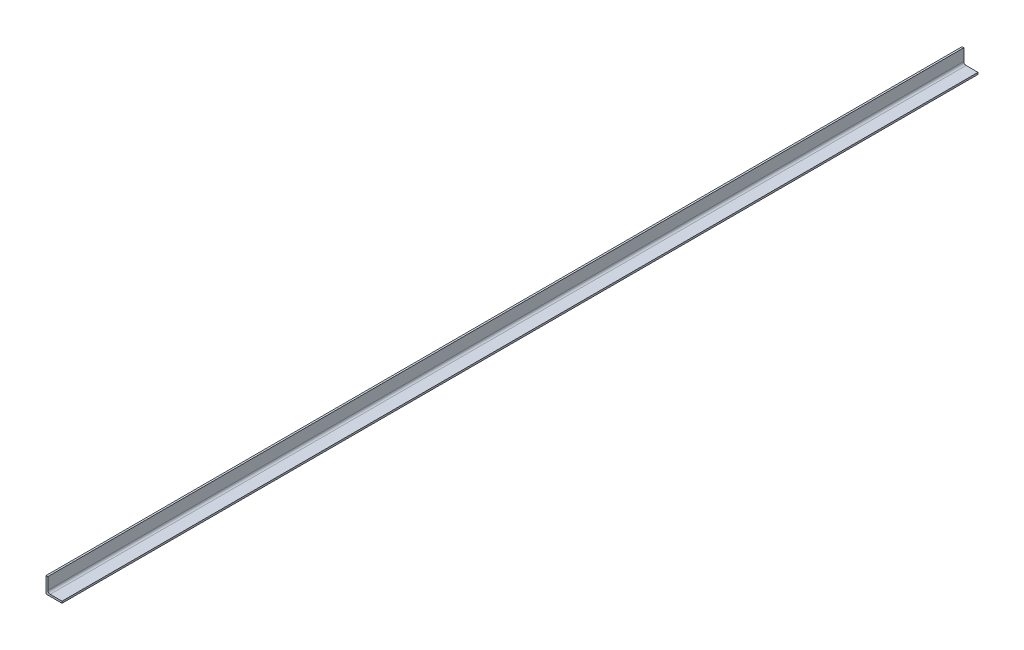
ISO-10303-21;
HEADER;
FILE_DESCRIPTION(('STEP AP214'),'2;1');
FILE_NAME('part.step','',(''),(''),'','','');
FILE_SCHEMA(('AUTOMOTIVE_DESIGN { 1 0 10303 214 1 1 1 1 }'));
ENDSEC;
DATA;
#1=APPLICATION_CONTEXT('core data for automotive mechanical design processes');
#2=APPLICATION_PROTOCOL_DEFINITION('international standard','automotive_design',2000,#1);
#3=PRODUCT_CONTEXT('',#1,'mechanical');
#4=PRODUCT('Part','Part','',(#3));
#5=PRODUCT_RELATED_PRODUCT_CATEGORY('part','',(#4));
#6=PRODUCT_DEFINITION_FORMATION('','',#4);
#7=PRODUCT_DEFINITION_CONTEXT('part definition',#1,'design');
#8=PRODUCT_DEFINITION('design','',#6,#7);
#9=PRODUCT_DEFINITION_SHAPE('','',#8);
#10=(LENGTH_UNIT() NAMED_UNIT(*) SI_UNIT(.MILLI.,.METRE.));
#11=(NAMED_UNIT(*) PLANE_ANGLE_UNIT() SI_UNIT($,.RADIAN.));
#12=(NAMED_UNIT(*) SI_UNIT($,.STERADIAN.) SOLID_ANGLE_UNIT());
#13=UNCERTAINTY_MEASURE_WITH_UNIT(LENGTH_MEASURE(1.E-05),#10,'distance_accuracy_value','');
#14=(GEOMETRIC_REPRESENTATION_CONTEXT(3) GLOBAL_UNCERTAINTY_ASSIGNED_CONTEXT((#13)) GLOBAL_UNIT_ASSIGNED_CONTEXT((#10,
#11,#12)) REPRESENTATION_CONTEXT('',''));
#15=CARTESIAN_POINT('',(0.,0.,0.));
#16=DIRECTION('',(0.,0.,1.));
#17=DIRECTION('',(1.,0.,0.));
#18=AXIS2_PLACEMENT_3D('',#15,#16,#17);
#19=CARTESIAN_POINT('',(35.,0.,2000.));
#20=DIRECTION('',(0.,1.,0.));
#21=DIRECTION('',(-1.,0.,0.));
#22=AXIS2_PLACEMENT_3D('',#19,#20,#21);
#23=PLANE('',#22);
#24=DIRECTION('',(1.,0.,0.));
#25=VECTOR('',#24,1.);
#26=CARTESIAN_POINT('',(35.,0.,0.));
#27=LINE('',#26,#25);
#28=CARTESIAN_POINT('',(0.,0.,0.));
#29=VERTEX_POINT('',#28);
#30=CARTESIAN_POINT('',(35.,0.,0.));
#31=VERTEX_POINT('',#30);
#32=EDGE_CURVE('E114',#29,#31,#27,.T.);
#33=ORIENTED_EDGE('',*,*,#32,.T.);
#34=DIRECTION('',(0.,0.,-1.));
#35=VECTOR('',#34,1.);
#36=CARTESIAN_POINT('',(35.,0.,2000.));
#37=LINE('',#36,#35);
#38=CARTESIAN_POINT('',(35.,0.,2000.));
#39=VERTEX_POINT('',#38);
#40=EDGE_CURVE('E96',#39,#31,#37,.T.);
#41=ORIENTED_EDGE('',*,*,#40,.F.);
#42=DIRECTION('',(1.,0.,0.));
#43=VECTOR('',#42,1.);
#44=CARTESIAN_POINT('',(35.,0.,2000.));
#45=LINE('',#44,#43);
#46=CARTESIAN_POINT('',(0.,0.,2000.));
#47=VERTEX_POINT('',#46);
#48=EDGE_CURVE('E102',#47,#39,#45,.T.);
#49=ORIENTED_EDGE('',*,*,#48,.F.);
#50=DIRECTION('',(0.,0.,-1.));
#51=VECTOR('',#50,1.);
#52=CARTESIAN_POINT('',(0.,0.,2000.));
#53=LINE('',#52,#51);
#54=EDGE_CURVE('E128',#47,#29,#53,.T.);
#55=ORIENTED_EDGE('',*,*,#54,.T.);
#56=EDGE_LOOP('',(#33,#41,#49,#55));
#57=FACE_BOUND('',#56,.T.);
#58=ADVANCED_FACE('F33',(#57),#23,.F.);
#59=CARTESIAN_POINT('',(35.,4.,2000.));
#60=DIRECTION('',(-1.,0.,0.));
#61=DIRECTION('',(0.,0.,1.));
#62=AXIS2_PLACEMENT_3D('',#59,#60,#61);
#63=PLANE('',#62);
#64=DIRECTION('',(0.,1.,0.));
#65=VECTOR('',#64,1.);
#66=CARTESIAN_POINT('',(35.,4.,0.));
#67=LINE('',#66,#65);
#68=CARTESIAN_POINT('',(35.,4.,0.));
#69=VERTEX_POINT('',#68);
#70=EDGE_CURVE('E137',#31,#69,#67,.T.);
#71=ORIENTED_EDGE('',*,*,#70,.T.);
#72=DIRECTION('',(0.,0.,-1.));
#73=VECTOR('',#72,1.);
#74=CARTESIAN_POINT('',(35.,4.,2000.));
#75=LINE('',#74,#73);
#76=CARTESIAN_POINT('',(35.,4.,2000.));
#77=VERTEX_POINT('',#76);
#78=EDGE_CURVE('E99',#77,#69,#75,.T.);
#79=ORIENTED_EDGE('',*,*,#78,.F.);
#80=DIRECTION('',(0.,1.,0.));
#81=VECTOR('',#80,1.);
#82=CARTESIAN_POINT('',(35.,4.,2000.));
#83=LINE('',#82,#81);
#84=EDGE_CURVE('E92',#39,#77,#83,.T.);
#85=ORIENTED_EDGE('',*,*,#84,.F.);
#86=ORIENTED_EDGE('',*,*,#40,.T.);
#87=EDGE_LOOP('',(#71,#79,#85,#86));
#88=FACE_BOUND('',#87,.T.);
#89=ADVANCED_FACE('F94',(#88),#63,.F.);
#90=CARTESIAN_POINT('',(4.,4.,2000.));
#91=DIRECTION('',(0.,-1.,0.));
#92=DIRECTION('',(1.,0.,0.));
#93=AXIS2_PLACEMENT_3D('',#90,#91,#92);
#94=PLANE('',#93);
#95=DIRECTION('',(-1.,0.,0.));
#96=VECTOR('',#95,1.);
#97=CARTESIAN_POINT('',(4.,4.,0.));
#98=LINE('',#97,#96);
#99=CARTESIAN_POINT('',(9.,4.,0.));
#100=VERTEX_POINT('',#99);
#101=EDGE_CURVE('E135',#69,#100,#98,.T.);
#102=ORIENTED_EDGE('',*,*,#101,.T.);
#103=DIRECTION('',(0.,0.,-1.));
#104=VECTOR('',#103,1.);
#105=CARTESIAN_POINT('',(9.,4.,2000.));
#106=LINE('',#105,#104);
#107=CARTESIAN_POINT('',(9.,4.,2000.));
#108=VERTEX_POINT('',#107);
#109=EDGE_CURVE('E48',#100,#108,#106,.F.);
#110=ORIENTED_EDGE('',*,*,#109,.T.);
#111=DIRECTION('',(-1.,0.,0.));
#112=VECTOR('',#111,1.);
#113=CARTESIAN_POINT('',(4.,4.,2000.));
#114=LINE('',#113,#112);
#115=EDGE_CURVE('E101',#77,#108,#114,.T.);
#116=ORIENTED_EDGE('',*,*,#115,.F.);
#117=ORIENTED_EDGE('',*,*,#78,.T.);
#118=EDGE_LOOP('',(#102,#110,#116,#117));
#119=FACE_BOUND('',#118,.T.);
#120=ADVANCED_FACE('F161',(#119),#94,.F.);
#121=CARTESIAN_POINT('',(4.,35.,2000.));
#122=DIRECTION('',(-1.,0.,0.));
#123=DIRECTION('',(0.,-1.,0.));
#124=AXIS2_PLACEMENT_3D('',#121,#122,#123);
#125=PLANE('',#124);
#126=DIRECTION('',(0.,1.,0.));
#127=VECTOR('',#126,1.);
#128=CARTESIAN_POINT('',(4.,35.,2000.));
#129=LINE('',#128,#127);
#130=CARTESIAN_POINT('',(4.,9.,2000.));
#131=VERTEX_POINT('',#130);
#132=CARTESIAN_POINT('',(4.,35.,2000.));
#133=VERTEX_POINT('',#132);
#134=EDGE_CURVE('E143',#131,#133,#129,.T.);
#135=ORIENTED_EDGE('',*,*,#134,.F.);
#136=DIRECTION('',(0.,0.,-1.));
#137=VECTOR('',#136,1.);
#138=CARTESIAN_POINT('',(4.,9.,0.));
#139=LINE('',#138,#137);
#140=CARTESIAN_POINT('',(4.,9.,0.));
#141=VERTEX_POINT('',#140);
#142=EDGE_CURVE('E115',#131,#141,#139,.T.);
#143=ORIENTED_EDGE('',*,*,#142,.T.);
#144=DIRECTION('',(0.,1.,0.));
#145=VECTOR('',#144,1.);
#146=CARTESIAN_POINT('',(4.,35.,0.));
#147=LINE('',#146,#145);
#148=CARTESIAN_POINT('',(4.,35.,0.));
#149=VERTEX_POINT('',#148);
#150=EDGE_CURVE('E133',#141,#149,#147,.T.);
#151=ORIENTED_EDGE('',*,*,#150,.T.);
#152=DIRECTION('',(0.,0.,-1.));
#153=VECTOR('',#152,1.);
#154=CARTESIAN_POINT('',(4.,35.,2000.));
#155=LINE('',#154,#153);
#156=EDGE_CURVE('E119',#133,#149,#155,.T.);
#157=ORIENTED_EDGE('',*,*,#156,.F.);
#158=EDGE_LOOP('',(#135,#143,#151,#157));
#159=FACE_BOUND('',#158,.T.);
#160=ADVANCED_FACE('F150',(#159),#125,.F.);
#161=CARTESIAN_POINT('',(0.,35.,2000.));
#162=DIRECTION('',(0.,-1.,0.));
#163=DIRECTION('',(0.,0.,-1.));
#164=AXIS2_PLACEMENT_3D('',#161,#162,#163);
#165=PLANE('',#164);
#166=DIRECTION('',(-1.,0.,0.));
#167=VECTOR('',#166,1.);
#168=CARTESIAN_POINT('',(0.,35.,0.));
#169=LINE('',#168,#167);
#170=CARTESIAN_POINT('',(0.,35.,0.));
#171=VERTEX_POINT('',#170);
#172=EDGE_CURVE('E131',#149,#171,#169,.T.);
#173=ORIENTED_EDGE('',*,*,#172,.T.);
#174=DIRECTION('',(0.,0.,-1.));
#175=VECTOR('',#174,1.);
#176=CARTESIAN_POINT('',(0.,35.,2000.));
#177=LINE('',#176,#175);
#178=CARTESIAN_POINT('',(0.,35.,2000.));
#179=VERTEX_POINT('',#178);
#180=EDGE_CURVE('E125',#179,#171,#177,.T.);
#181=ORIENTED_EDGE('',*,*,#180,.F.);
#182=DIRECTION('',(-1.,0.,0.));
#183=VECTOR('',#182,1.);
#184=CARTESIAN_POINT('',(0.,35.,2000.));
#185=LINE('',#184,#183);
#186=EDGE_CURVE('E141',#133,#179,#185,.T.);
#187=ORIENTED_EDGE('',*,*,#186,.F.);
#188=ORIENTED_EDGE('',*,*,#156,.T.);
#189=EDGE_LOOP('',(#173,#181,#187,#188));
#190=FACE_BOUND('',#189,.T.);
#191=ADVANCED_FACE('F157',(#190),#165,.F.);
#192=CARTESIAN_POINT('',(0.,0.,2000.));
#193=DIRECTION('',(1.,0.,0.));
#194=DIRECTION('',(0.,0.,-1.));
#195=AXIS2_PLACEMENT_3D('',#192,#193,#194);
#196=PLANE('',#195);
#197=DIRECTION('',(0.,-1.,0.));
#198=VECTOR('',#197,1.);
#199=CARTESIAN_POINT('',(0.,0.,0.));
#200=LINE('',#199,#198);
#201=EDGE_CURVE('E111',#171,#29,#200,.T.);
#202=ORIENTED_EDGE('',*,*,#201,.T.);
#203=ORIENTED_EDGE('',*,*,#54,.F.);
#204=DIRECTION('',(0.,-1.,0.));
#205=VECTOR('',#204,1.);
#206=CARTESIAN_POINT('',(0.,0.,2000.));
#207=LINE('',#206,#205);
#208=EDGE_CURVE('E107',#179,#47,#207,.T.);
#209=ORIENTED_EDGE('',*,*,#208,.F.);
#210=ORIENTED_EDGE('',*,*,#180,.T.);
#211=EDGE_LOOP('',(#202,#203,#209,#210));
#212=FACE_BOUND('',#211,.T.);
#213=ADVANCED_FACE('F160',(#212),#196,.F.);
#214=CARTESIAN_POINT('',(0.,0.,2000.));
#215=DIRECTION('',(0.,0.,-1.));
#216=DIRECTION('',(-1.,0.,0.));
#217=AXIS2_PLACEMENT_3D('',#214,#215,#216);
#218=PLANE('',#217);
#219=ORIENTED_EDGE('',*,*,#48,.T.);
#220=ORIENTED_EDGE('',*,*,#84,.T.);
#221=ORIENTED_EDGE('',*,*,#115,.T.);
#222=CARTESIAN_POINT('',(9.,9.,2000.));
#223=DIRECTION('',(0.,0.,-1.));
#224=DIRECTION('',(-1.,0.,0.));
#225=AXIS2_PLACEMENT_3D('',#222,#223,#224);
#226=CIRCLE('',#225,5.);
#227=EDGE_CURVE('E11',#108,#131,#226,.T.);
#228=ORIENTED_EDGE('',*,*,#227,.T.);
#229=ORIENTED_EDGE('',*,*,#134,.T.);
#230=ORIENTED_EDGE('',*,*,#186,.T.);
#231=ORIENTED_EDGE('',*,*,#208,.T.);
#232=EDGE_LOOP('',(#219,#220,#221,#228,#229,#230,#231));
#233=FACE_BOUND('',#232,.T.);
#234=ADVANCED_FACE('F105',(#233),#218,.F.);
#235=CARTESIAN_POINT('',(0.,0.,0.));
#236=DIRECTION('',(0.,0.,-1.));
#237=DIRECTION('',(-1.,0.,0.));
#238=AXIS2_PLACEMENT_3D('',#235,#236,#237);
#239=PLANE('',#238);
#240=ORIENTED_EDGE('',*,*,#32,.F.);
#241=ORIENTED_EDGE('',*,*,#201,.F.);
#242=ORIENTED_EDGE('',*,*,#172,.F.);
#243=ORIENTED_EDGE('',*,*,#150,.F.);
#244=CARTESIAN_POINT('',(9.,9.,0.));
#245=DIRECTION('',(0.,0.,-1.));
#246=DIRECTION('',(-1.,0.,0.));
#247=AXIS2_PLACEMENT_3D('',#244,#245,#246);
#248=CIRCLE('',#247,5.);
#249=EDGE_CURVE('E41',#141,#100,#248,.F.);
#250=ORIENTED_EDGE('',*,*,#249,.T.);
#251=ORIENTED_EDGE('',*,*,#101,.F.);
#252=ORIENTED_EDGE('',*,*,#70,.F.);
#253=EDGE_LOOP('',(#240,#241,#242,#243,#250,#251,#252));
#254=FACE_BOUND('',#253,.T.);
#255=ADVANCED_FACE('F153',(#254),#239,.T.);
#256=CARTESIAN_POINT('',(9.,9.,2000.));
#257=DIRECTION('',(0.,0.,1.));
#258=DIRECTION('',(1.,0.,0.));
#259=AXIS2_PLACEMENT_3D('',#256,#257,#258);
#260=CYLINDRICAL_SURFACE('',#259,5.);
#261=ORIENTED_EDGE('',*,*,#227,.F.);
#262=ORIENTED_EDGE('',*,*,#109,.F.);
#263=ORIENTED_EDGE('',*,*,#249,.F.);
#264=ORIENTED_EDGE('',*,*,#142,.F.);
#265=EDGE_LOOP('',(#261,#262,#263,#264));
#266=FACE_BOUND('',#265,.T.);
#267=ADVANCED_FACE('F35',(#266),#260,.F.);
#268=CLOSED_SHELL('',(#58,#89,#120,#160,#191,#213,#234,#255,#267));
#269=MANIFOLD_SOLID_BREP('B2',#268);
#270=ADVANCED_BREP_SHAPE_REPRESENTATION('',(#18,#269),#14);
#271=SHAPE_DEFINITION_REPRESENTATION(#9,#270);
ENDSEC;
END-ISO-10303-21;
